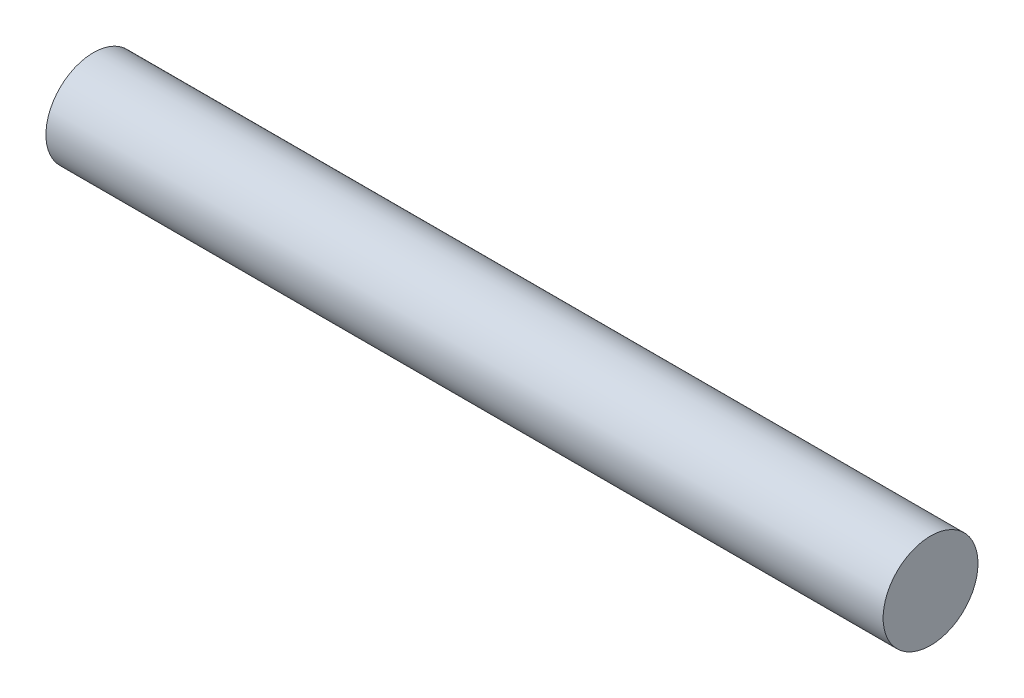
ISO-10303-21;
HEADER;
FILE_DESCRIPTION(('STEP AP214'),'2;1');
FILE_NAME('part.step','',(''),(''),'','','');
FILE_SCHEMA(('AUTOMOTIVE_DESIGN { 1 0 10303 214 1 1 1 1 }'));
ENDSEC;
DATA;
#1=APPLICATION_CONTEXT('core data for automotive mechanical design processes');
#2=APPLICATION_PROTOCOL_DEFINITION('international standard','automotive_design',2000,#1);
#3=PRODUCT_CONTEXT('',#1,'mechanical');
#4=PRODUCT('Part','Part','',(#3));
#5=PRODUCT_RELATED_PRODUCT_CATEGORY('part','',(#4));
#6=PRODUCT_DEFINITION_FORMATION('','',#4);
#7=PRODUCT_DEFINITION_CONTEXT('part definition',#1,'design');
#8=PRODUCT_DEFINITION('design','',#6,#7);
#9=PRODUCT_DEFINITION_SHAPE('','',#8);
#10=(LENGTH_UNIT() NAMED_UNIT(*) SI_UNIT(.MILLI.,.METRE.));
#11=(NAMED_UNIT(*) PLANE_ANGLE_UNIT() SI_UNIT($,.RADIAN.));
#12=(NAMED_UNIT(*) SI_UNIT($,.STERADIAN.) SOLID_ANGLE_UNIT());
#13=UNCERTAINTY_MEASURE_WITH_UNIT(LENGTH_MEASURE(1.E-05),#10,'distance_accuracy_value','');
#14=(GEOMETRIC_REPRESENTATION_CONTEXT(3) GLOBAL_UNCERTAINTY_ASSIGNED_CONTEXT((#13)) GLOBAL_UNIT_ASSIGNED_CONTEXT((#10,
#11,#12)) REPRESENTATION_CONTEXT('',''));
#15=CARTESIAN_POINT('',(0.,0.,0.));
#16=DIRECTION('',(0.,0.,1.));
#17=DIRECTION('',(1.,0.,0.));
#18=AXIS2_PLACEMENT_3D('',#15,#16,#17);
#19=CARTESIAN_POINT('',(150.,0.,0.));
#20=DIRECTION('',(-1.,0.,0.));
#21=DIRECTION('',(0.,0.,1.));
#22=AXIS2_PLACEMENT_3D('',#19,#20,#21);
#23=CYLINDRICAL_SURFACE('',#22,8.5);
#24=CARTESIAN_POINT('',(150.,0.,0.));
#25=DIRECTION('',(1.,0.,0.));
#26=DIRECTION('',(0.,0.,-1.));
#27=AXIS2_PLACEMENT_3D('',#24,#25,#26);
#28=CIRCLE('',#27,8.5);
#29=CARTESIAN_POINT('',(150.,0.,-8.5));
#30=VERTEX_POINT('',#29);
#31=EDGE_CURVE('E10',#30,#30,#28,.T.);
#32=ORIENTED_EDGE('',*,*,#31,.F.);
#33=EDGE_LOOP('',(#32));
#34=FACE_BOUND('',#33,.T.);
#35=CARTESIAN_POINT('',(0.,0.,0.));
#36=DIRECTION('',(1.,0.,0.));
#37=DIRECTION('',(0.,0.,-1.));
#38=AXIS2_PLACEMENT_3D('',#35,#36,#37);
#39=CIRCLE('',#38,8.5);
#40=CARTESIAN_POINT('',(0.,0.,-8.5));
#41=VERTEX_POINT('',#40);
#42=EDGE_CURVE('E36',#41,#41,#39,.T.);
#43=ORIENTED_EDGE('',*,*,#42,.T.);
#44=EDGE_LOOP('',(#43));
#45=FACE_BOUND('',#44,.T.);
#46=ADVANCED_FACE('F33',(#34,#45),#23,.T.);
#47=CARTESIAN_POINT('',(150.,0.,0.));
#48=DIRECTION('',(1.,0.,0.));
#49=DIRECTION('',(0.,0.,-1.));
#50=AXIS2_PLACEMENT_3D('',#47,#48,#49);
#51=PLANE('',#50);
#52=ORIENTED_EDGE('',*,*,#31,.T.);
#53=EDGE_LOOP('',(#52));
#54=FACE_BOUND('',#53,.T.);
#55=ADVANCED_FACE('F48',(#54),#51,.T.);
#56=CARTESIAN_POINT('',(0.,0.,0.));
#57=DIRECTION('',(1.,0.,0.));
#58=DIRECTION('',(0.,0.,-1.));
#59=AXIS2_PLACEMENT_3D('',#56,#57,#58);
#60=PLANE('',#59);
#61=ORIENTED_EDGE('',*,*,#42,.F.);
#62=EDGE_LOOP('',(#61));
#63=FACE_BOUND('',#62,.T.);
#64=ADVANCED_FACE('F46',(#63),#60,.F.);
#65=CLOSED_SHELL('',(#46,#55,#64));
#66=MANIFOLD_SOLID_BREP('B2',#65);
#67=ADVANCED_BREP_SHAPE_REPRESENTATION('',(#18,#66),#14);
#68=SHAPE_DEFINITION_REPRESENTATION(#9,#67);
ENDSEC;
END-ISO-10303-21;
